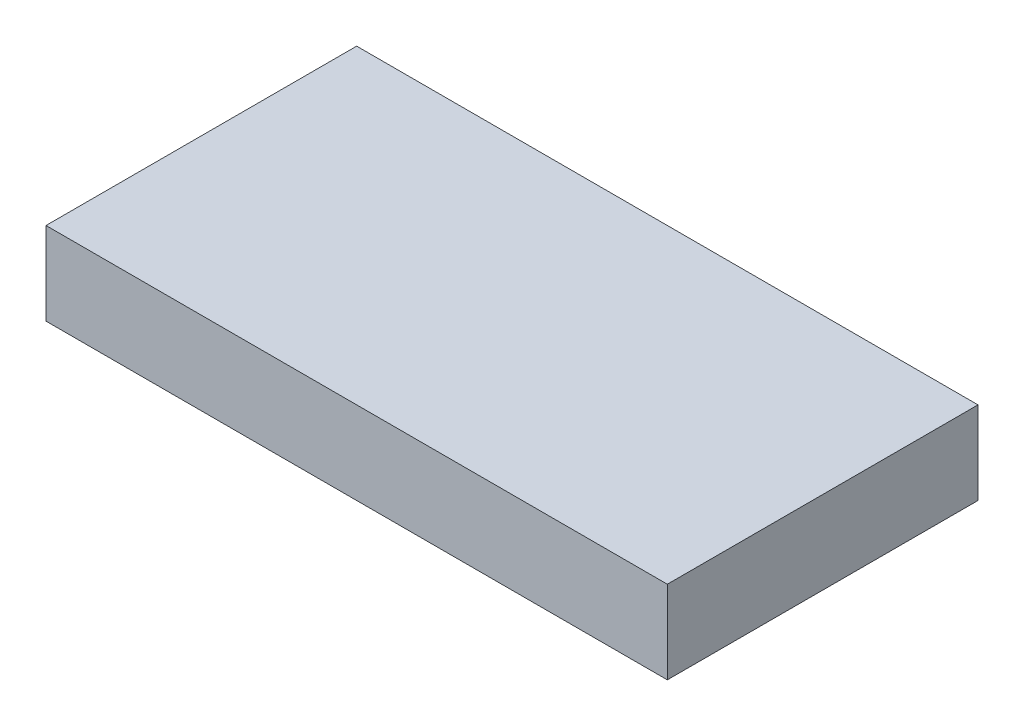
ISO-10303-21;
HEADER;
FILE_DESCRIPTION(('STEP AP214'),'2;1');
FILE_NAME('part.step','',(''),(''),'','','');
FILE_SCHEMA(('AUTOMOTIVE_DESIGN { 1 0 10303 214 1 1 1 1 }'));
ENDSEC;
DATA;
#1=APPLICATION_CONTEXT('core data for automotive mechanical design processes');
#2=APPLICATION_PROTOCOL_DEFINITION('international standard','automotive_design',2000,#1);
#3=PRODUCT_CONTEXT('',#1,'mechanical');
#4=PRODUCT('Part','Part','',(#3));
#5=PRODUCT_RELATED_PRODUCT_CATEGORY('part','',(#4));
#6=PRODUCT_DEFINITION_FORMATION('','',#4);
#7=PRODUCT_DEFINITION_CONTEXT('part definition',#1,'design');
#8=PRODUCT_DEFINITION('design','',#6,#7);
#9=PRODUCT_DEFINITION_SHAPE('','',#8);
#10=(LENGTH_UNIT() NAMED_UNIT(*) SI_UNIT(.MILLI.,.METRE.));
#11=(NAMED_UNIT(*) PLANE_ANGLE_UNIT() SI_UNIT($,.RADIAN.));
#12=(NAMED_UNIT(*) SI_UNIT($,.STERADIAN.) SOLID_ANGLE_UNIT());
#13=UNCERTAINTY_MEASURE_WITH_UNIT(LENGTH_MEASURE(1.E-05),#10,'distance_accuracy_value','');
#14=(GEOMETRIC_REPRESENTATION_CONTEXT(3) GLOBAL_UNCERTAINTY_ASSIGNED_CONTEXT((#13)) GLOBAL_UNIT_ASSIGNED_CONTEXT((#10,
#11,#12)) REPRESENTATION_CONTEXT('',''));
#15=CARTESIAN_POINT('',(0.,0.,0.));
#16=DIRECTION('',(0.,0.,1.));
#17=DIRECTION('',(1.,0.,0.));
#18=AXIS2_PLACEMENT_3D('',#15,#16,#17);
#19=CARTESIAN_POINT('',(-30.,8.,-15.));
#20=DIRECTION('',(1.,0.,0.));
#21=DIRECTION('',(0.,0.,-1.));
#22=AXIS2_PLACEMENT_3D('',#19,#20,#21);
#23=PLANE('',#22);
#24=DIRECTION('',(0.,0.,1.));
#25=VECTOR('',#24,1.);
#26=CARTESIAN_POINT('',(-30.,0.,-15.));
#27=LINE('',#26,#25);
#28=CARTESIAN_POINT('',(-30.,0.,-15.));
#29=VERTEX_POINT('',#28);
#30=CARTESIAN_POINT('',(-30.,0.,15.));
#31=VERTEX_POINT('',#30);
#32=EDGE_CURVE('E97',#29,#31,#27,.T.);
#33=ORIENTED_EDGE('',*,*,#32,.T.);
#34=DIRECTION('',(0.,-1.,0.));
#35=VECTOR('',#34,1.);
#36=CARTESIAN_POINT('',(-30.,8.,15.));
#37=LINE('',#36,#35);
#38=CARTESIAN_POINT('',(-30.,8.,15.));
#39=VERTEX_POINT('',#38);
#40=EDGE_CURVE('E11',#39,#31,#37,.T.);
#41=ORIENTED_EDGE('',*,*,#40,.F.);
#42=DIRECTION('',(0.,0.,1.));
#43=VECTOR('',#42,1.);
#44=CARTESIAN_POINT('',(-30.,8.,-15.));
#45=LINE('',#44,#43);
#46=CARTESIAN_POINT('',(-30.,8.,-15.));
#47=VERTEX_POINT('',#46);
#48=EDGE_CURVE('E85',#47,#39,#45,.T.);
#49=ORIENTED_EDGE('',*,*,#48,.F.);
#50=DIRECTION('',(0.,-1.,0.));
#51=VECTOR('',#50,1.);
#52=CARTESIAN_POINT('',(-30.,8.,-15.));
#53=LINE('',#52,#51);
#54=EDGE_CURVE('E93',#47,#29,#53,.T.);
#55=ORIENTED_EDGE('',*,*,#54,.T.);
#56=EDGE_LOOP('',(#33,#41,#49,#55));
#57=FACE_BOUND('',#56,.T.);
#58=ADVANCED_FACE('F34',(#57),#23,.F.);
#59=CARTESIAN_POINT('',(-30.,8.,15.));
#60=DIRECTION('',(0.,0.,-1.));
#61=DIRECTION('',(-1.,0.,0.));
#62=AXIS2_PLACEMENT_3D('',#59,#60,#61);
#63=PLANE('',#62);
#64=DIRECTION('',(1.,0.,0.));
#65=VECTOR('',#64,1.);
#66=CARTESIAN_POINT('',(-30.,0.,15.));
#67=LINE('',#66,#65);
#68=CARTESIAN_POINT('',(30.,0.,15.));
#69=VERTEX_POINT('',#68);
#70=EDGE_CURVE('E89',#31,#69,#67,.T.);
#71=ORIENTED_EDGE('',*,*,#70,.T.);
#72=DIRECTION('',(0.,-1.,0.));
#73=VECTOR('',#72,1.);
#74=CARTESIAN_POINT('',(30.,8.,15.));
#75=LINE('',#74,#73);
#76=CARTESIAN_POINT('',(30.,8.,15.));
#77=VERTEX_POINT('',#76);
#78=EDGE_CURVE('E42',#77,#69,#75,.T.);
#79=ORIENTED_EDGE('',*,*,#78,.F.);
#80=DIRECTION('',(1.,0.,0.));
#81=VECTOR('',#80,1.);
#82=CARTESIAN_POINT('',(-30.,8.,15.));
#83=LINE('',#82,#81);
#84=EDGE_CURVE('E80',#39,#77,#83,.T.);
#85=ORIENTED_EDGE('',*,*,#84,.F.);
#86=ORIENTED_EDGE('',*,*,#40,.T.);
#87=EDGE_LOOP('',(#71,#79,#85,#86));
#88=FACE_BOUND('',#87,.T.);
#89=ADVANCED_FACE('F88',(#88),#63,.F.);
#90=CARTESIAN_POINT('',(30.,8.,-15.));
#91=DIRECTION('',(-1.,0.,0.));
#92=DIRECTION('',(0.,0.,1.));
#93=AXIS2_PLACEMENT_3D('',#90,#91,#92);
#94=PLANE('',#93);
#95=DIRECTION('',(0.,0.,-1.));
#96=VECTOR('',#95,1.);
#97=CARTESIAN_POINT('',(30.,0.,-15.));
#98=LINE('',#97,#96);
#99=CARTESIAN_POINT('',(30.,0.,-15.));
#100=VERTEX_POINT('',#99);
#101=EDGE_CURVE('E67',#69,#100,#98,.T.);
#102=ORIENTED_EDGE('',*,*,#101,.T.);
#103=DIRECTION('',(0.,-1.,0.));
#104=VECTOR('',#103,1.);
#105=CARTESIAN_POINT('',(30.,8.,-15.));
#106=LINE('',#105,#104);
#107=CARTESIAN_POINT('',(30.,8.,-15.));
#108=VERTEX_POINT('',#107);
#109=EDGE_CURVE('E90',#108,#100,#106,.T.);
#110=ORIENTED_EDGE('',*,*,#109,.F.);
#111=DIRECTION('',(0.,0.,-1.));
#112=VECTOR('',#111,1.);
#113=CARTESIAN_POINT('',(30.,8.,-15.));
#114=LINE('',#113,#112);
#115=EDGE_CURVE('E83',#77,#108,#114,.T.);
#116=ORIENTED_EDGE('',*,*,#115,.F.);
#117=ORIENTED_EDGE('',*,*,#78,.T.);
#118=EDGE_LOOP('',(#102,#110,#116,#117));
#119=FACE_BOUND('',#118,.T.);
#120=ADVANCED_FACE('F91',(#119),#94,.F.);
#121=CARTESIAN_POINT('',(-30.,8.,-15.));
#122=DIRECTION('',(0.,0.,1.));
#123=DIRECTION('',(1.,0.,0.));
#124=AXIS2_PLACEMENT_3D('',#121,#122,#123);
#125=PLANE('',#124);
#126=DIRECTION('',(-1.,0.,0.));
#127=VECTOR('',#126,1.);
#128=CARTESIAN_POINT('',(-30.,0.,-15.));
#129=LINE('',#128,#127);
#130=EDGE_CURVE('E73',#100,#29,#129,.T.);
#131=ORIENTED_EDGE('',*,*,#130,.T.);
#132=ORIENTED_EDGE('',*,*,#54,.F.);
#133=DIRECTION('',(-1.,0.,0.));
#134=VECTOR('',#133,1.);
#135=CARTESIAN_POINT('',(-30.,8.,-15.));
#136=LINE('',#135,#134);
#137=EDGE_CURVE('E50',#108,#47,#136,.T.);
#138=ORIENTED_EDGE('',*,*,#137,.F.);
#139=ORIENTED_EDGE('',*,*,#109,.T.);
#140=EDGE_LOOP('',(#131,#132,#138,#139));
#141=FACE_BOUND('',#140,.T.);
#142=ADVANCED_FACE('F104',(#141),#125,.F.);
#143=CARTESIAN_POINT('',(0.,8.,0.));
#144=DIRECTION('',(0.,1.,0.));
#145=DIRECTION('',(0.,0.,1.));
#146=AXIS2_PLACEMENT_3D('',#143,#144,#145);
#147=PLANE('',#146);
#148=ORIENTED_EDGE('',*,*,#48,.T.);
#149=ORIENTED_EDGE('',*,*,#84,.T.);
#150=ORIENTED_EDGE('',*,*,#115,.T.);
#151=ORIENTED_EDGE('',*,*,#137,.T.);
#152=EDGE_LOOP('',(#148,#149,#150,#151));
#153=FACE_BOUND('',#152,.T.);
#154=ADVANCED_FACE('F81',(#153),#147,.T.);
#155=CARTESIAN_POINT('',(0.,0.,0.));
#156=DIRECTION('',(0.,1.,0.));
#157=DIRECTION('',(0.,0.,1.));
#158=AXIS2_PLACEMENT_3D('',#155,#156,#157);
#159=PLANE('',#158);
#160=ORIENTED_EDGE('',*,*,#32,.F.);
#161=ORIENTED_EDGE('',*,*,#130,.F.);
#162=ORIENTED_EDGE('',*,*,#101,.F.);
#163=ORIENTED_EDGE('',*,*,#70,.F.);
#164=EDGE_LOOP('',(#160,#161,#162,#163));
#165=FACE_BOUND('',#164,.T.);
#166=ADVANCED_FACE('F107',(#165),#159,.F.);
#167=CLOSED_SHELL('',(#58,#89,#120,#142,#154,#166));
#168=MANIFOLD_SOLID_BREP('B2',#167);
#169=ADVANCED_BREP_SHAPE_REPRESENTATION('',(#18,#168),#14);
#170=SHAPE_DEFINITION_REPRESENTATION(#9,#169);
ENDSEC;
END-ISO-10303-21;
